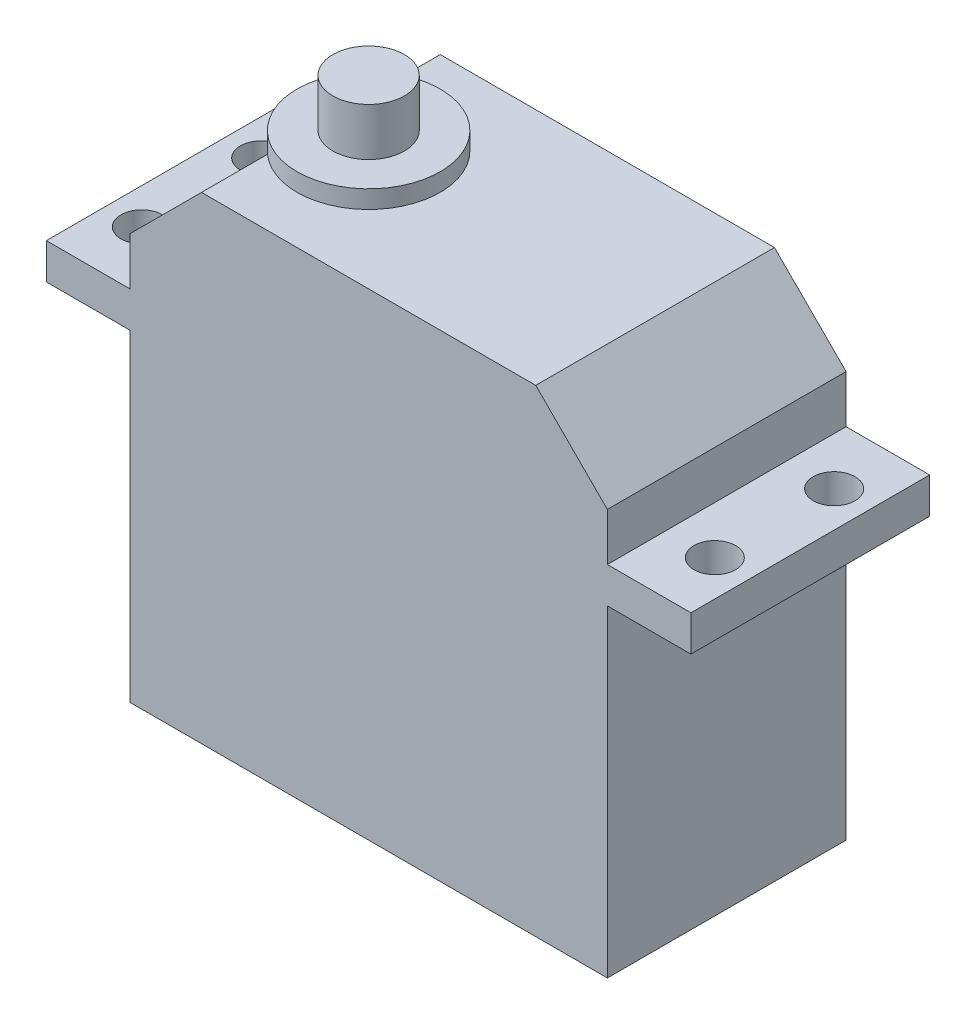
ISO-10303-21;
HEADER;
FILE_DESCRIPTION(('STEP AP214'),'2;1');
FILE_NAME('part.step','',(''),(''),'','','');
FILE_SCHEMA(('AUTOMOTIVE_DESIGN { 1 0 10303 214 1 1 1 1 }'));
ENDSEC;
DATA;
#1=APPLICATION_CONTEXT('core data for automotive mechanical design processes');
#2=APPLICATION_PROTOCOL_DEFINITION('international standard','automotive_design',2000,#1);
#3=PRODUCT_CONTEXT('',#1,'mechanical');
#4=PRODUCT('Part','Part','',(#3));
#5=PRODUCT_RELATED_PRODUCT_CATEGORY('part','',(#4));
#6=PRODUCT_DEFINITION_FORMATION('','',#4);
#7=PRODUCT_DEFINITION_CONTEXT('part definition',#1,'design');
#8=PRODUCT_DEFINITION('design','',#6,#7);
#9=PRODUCT_DEFINITION_SHAPE('','',#8);
#10=(LENGTH_UNIT() NAMED_UNIT(*) SI_UNIT(.MILLI.,.METRE.));
#11=(NAMED_UNIT(*) PLANE_ANGLE_UNIT() SI_UNIT($,.RADIAN.));
#12=(NAMED_UNIT(*) SI_UNIT($,.STERADIAN.) SOLID_ANGLE_UNIT());
#13=UNCERTAINTY_MEASURE_WITH_UNIT(LENGTH_MEASURE(1.E-05),#10,'distance_accuracy_value','');
#14=(GEOMETRIC_REPRESENTATION_CONTEXT(3) GLOBAL_UNCERTAINTY_ASSIGNED_CONTEXT((#13)) GLOBAL_UNIT_ASSIGNED_CONTEXT((#10,
#11,#12)) REPRESENTATION_CONTEXT('',''));
#15=CARTESIAN_POINT('',(0.,0.,0.));
#16=DIRECTION('',(0.,0.,1.));
#17=DIRECTION('',(1.,0.,0.));
#18=AXIS2_PLACEMENT_3D('',#15,#16,#17);
#19=CARTESIAN_POINT('',(0.,0.,10.));
#20=DIRECTION('',(1.,0.,0.));
#21=DIRECTION('',(0.,0.,-1.));
#22=AXIS2_PLACEMENT_3D('',#19,#20,#21);
#23=PLANE('',#22);
#24=DIRECTION('',(0.,0.,1.));
#25=VECTOR('',#24,1.);
#26=CARTESIAN_POINT('',(0.,27.,10.));
#27=LINE('',#26,#25);
#28=CARTESIAN_POINT('',(0.,27.,-10.));
#29=VERTEX_POINT('',#28);
#30=CARTESIAN_POINT('',(0.,27.,10.));
#31=VERTEX_POINT('',#30);
#32=EDGE_CURVE('E245',#29,#31,#27,.T.);
#33=ORIENTED_EDGE('',*,*,#32,.F.);
#34=DIRECTION('',(0.,-1.,0.));
#35=VECTOR('',#34,1.);
#36=CARTESIAN_POINT('',(0.,0.,-10.));
#37=LINE('',#36,#35);
#38=CARTESIAN_POINT('',(0.,0.,-10.));
#39=VERTEX_POINT('',#38);
#40=EDGE_CURVE('E248',#29,#39,#37,.T.);
#41=ORIENTED_EDGE('',*,*,#40,.T.);
#42=DIRECTION('',(0.,0.,-1.));
#43=VECTOR('',#42,1.);
#44=CARTESIAN_POINT('',(0.,0.,10.));
#45=LINE('',#44,#43);
#46=CARTESIAN_POINT('',(0.,0.,10.));
#47=VERTEX_POINT('',#46);
#48=EDGE_CURVE('E161',#47,#39,#45,.T.);
#49=ORIENTED_EDGE('',*,*,#48,.F.);
#50=DIRECTION('',(0.,-1.,0.));
#51=VECTOR('',#50,1.);
#52=CARTESIAN_POINT('',(0.,0.,10.));
#53=LINE('',#52,#51);
#54=EDGE_CURVE('E252',#31,#47,#53,.T.);
#55=ORIENTED_EDGE('',*,*,#54,.F.);
#56=EDGE_LOOP('',(#33,#41,#49,#55));
#57=FACE_BOUND('',#56,.T.);
#58=ADVANCED_FACE('F47',(#57),#23,.F.);
#59=CARTESIAN_POINT('',(0.,34.,10.));
#60=VERTEX_POINT('',#59);
#61=CARTESIAN_POINT('',(0.,30.,10.));
#62=VERTEX_POINT('',#61);
#63=EDGE_CURVE('E249',#60,#62,#53,.T.);
#64=ORIENTED_EDGE('',*,*,#63,.F.);
#65=DIRECTION('',(0.,0.,-1.));
#66=VECTOR('',#65,1.);
#67=CARTESIAN_POINT('',(0.,34.,10.));
#68=LINE('',#67,#66);
#69=CARTESIAN_POINT('',(0.,34.,-10.));
#70=VERTEX_POINT('',#69);
#71=EDGE_CURVE('E172',#60,#70,#68,.T.);
#72=ORIENTED_EDGE('',*,*,#71,.T.);
#73=CARTESIAN_POINT('',(0.,30.,-10.));
#74=VERTEX_POINT('',#73);
#75=EDGE_CURVE('E261',#70,#74,#37,.T.);
#76=ORIENTED_EDGE('',*,*,#75,.T.);
#77=DIRECTION('',(0.,0.,-1.));
#78=VECTOR('',#77,1.);
#79=CARTESIAN_POINT('',(0.,30.,10.));
#80=LINE('',#79,#78);
#81=EDGE_CURVE('E239',#62,#74,#80,.T.);
#82=ORIENTED_EDGE('',*,*,#81,.F.);
#83=EDGE_LOOP('',(#64,#72,#76,#82));
#84=FACE_BOUND('',#83,.T.);
#85=ADVANCED_FACE('F338',(#84),#23,.F.);
#86=CARTESIAN_POINT('',(40.,0.,10.));
#87=DIRECTION('',(-1.,0.,0.));
#88=DIRECTION('',(0.,0.,1.));
#89=AXIS2_PLACEMENT_3D('',#86,#87,#88);
#90=PLANE('',#89);
#91=DIRECTION('',(0.,0.,-1.));
#92=VECTOR('',#91,1.);
#93=CARTESIAN_POINT('',(40.,27.,10.));
#94=LINE('',#93,#92);
#95=CARTESIAN_POINT('',(40.,27.,10.));
#96=VERTEX_POINT('',#95);
#97=CARTESIAN_POINT('',(40.,27.,-10.));
#98=VERTEX_POINT('',#97);
#99=EDGE_CURVE('E242',#96,#98,#94,.T.);
#100=ORIENTED_EDGE('',*,*,#99,.F.);
#101=DIRECTION('',(0.,1.,0.));
#102=VECTOR('',#101,1.);
#103=CARTESIAN_POINT('',(40.,0.,10.));
#104=LINE('',#103,#102);
#105=CARTESIAN_POINT('',(40.,0.,10.));
#106=VERTEX_POINT('',#105);
#107=EDGE_CURVE('E255',#106,#96,#104,.T.);
#108=ORIENTED_EDGE('',*,*,#107,.F.);
#109=DIRECTION('',(0.,0.,-1.));
#110=VECTOR('',#109,1.);
#111=CARTESIAN_POINT('',(40.,0.,10.));
#112=LINE('',#111,#110);
#113=CARTESIAN_POINT('',(40.,0.,-10.));
#114=VERTEX_POINT('',#113);
#115=EDGE_CURVE('E260',#106,#114,#112,.T.);
#116=ORIENTED_EDGE('',*,*,#115,.T.);
#117=DIRECTION('',(0.,1.,0.));
#118=VECTOR('',#117,1.);
#119=CARTESIAN_POINT('',(40.,0.,-10.));
#120=LINE('',#119,#118);
#121=EDGE_CURVE('E266',#114,#98,#120,.T.);
#122=ORIENTED_EDGE('',*,*,#121,.T.);
#123=EDGE_LOOP('',(#100,#108,#116,#122));
#124=FACE_BOUND('',#123,.T.);
#125=ADVANCED_FACE('F314',(#124),#90,.F.);
#126=CARTESIAN_POINT('',(40.,30.,-10.));
#127=VERTEX_POINT('',#126);
#128=CARTESIAN_POINT('',(40.,34.,-10.));
#129=VERTEX_POINT('',#128);
#130=EDGE_CURVE('E265',#127,#129,#120,.T.);
#131=ORIENTED_EDGE('',*,*,#130,.T.);
#132=DIRECTION('',(0.,0.,1.));
#133=VECTOR('',#132,1.);
#134=CARTESIAN_POINT('',(40.,34.,10.));
#135=LINE('',#134,#133);
#136=CARTESIAN_POINT('',(40.,34.,10.));
#137=VERTEX_POINT('',#136);
#138=EDGE_CURVE('E281',#129,#137,#135,.T.);
#139=ORIENTED_EDGE('',*,*,#138,.T.);
#140=CARTESIAN_POINT('',(40.,30.,10.));
#141=VERTEX_POINT('',#140);
#142=EDGE_CURVE('E254',#141,#137,#104,.T.);
#143=ORIENTED_EDGE('',*,*,#142,.F.);
#144=DIRECTION('',(0.,0.,1.));
#145=VECTOR('',#144,1.);
#146=CARTESIAN_POINT('',(40.,30.,10.));
#147=LINE('',#146,#145);
#148=EDGE_CURVE('E236',#127,#141,#147,.T.);
#149=ORIENTED_EDGE('',*,*,#148,.F.);
#150=EDGE_LOOP('',(#131,#139,#143,#149));
#151=FACE_BOUND('',#150,.T.);
#152=ADVANCED_FACE('F297',(#151),#90,.F.);
#153=CARTESIAN_POINT('',(0.,0.,10.));
#154=DIRECTION('',(0.,1.,0.));
#155=DIRECTION('',(0.,0.,1.));
#156=AXIS2_PLACEMENT_3D('',#153,#154,#155);
#157=PLANE('',#156);
#158=DIRECTION('',(1.,0.,0.));
#159=VECTOR('',#158,1.);
#160=CARTESIAN_POINT('',(0.,0.,-10.));
#161=LINE('',#160,#159);
#162=EDGE_CURVE('E263',#39,#114,#161,.T.);
#163=ORIENTED_EDGE('',*,*,#162,.T.);
#164=ORIENTED_EDGE('',*,*,#115,.F.);
#165=DIRECTION('',(1.,0.,0.));
#166=VECTOR('',#165,1.);
#167=CARTESIAN_POINT('',(0.,0.,10.));
#168=LINE('',#167,#166);
#169=EDGE_CURVE('E251',#47,#106,#168,.T.);
#170=ORIENTED_EDGE('',*,*,#169,.F.);
#171=ORIENTED_EDGE('',*,*,#48,.T.);
#172=EDGE_LOOP('',(#163,#164,#170,#171));
#173=FACE_BOUND('',#172,.T.);
#174=ADVANCED_FACE('F319',(#173),#157,.F.);
#175=CARTESIAN_POINT('',(0.,40.,10.));
#176=DIRECTION('',(0.,-1.,0.));
#177=DIRECTION('',(0.,0.,-1.));
#178=AXIS2_PLACEMENT_3D('',#175,#176,#177);
#179=PLANE('',#178);
#180=DIRECTION('',(0.,0.,1.));
#181=VECTOR('',#180,1.);
#182=CARTESIAN_POINT('',(6.00000000000002,40.,10.));
#183=LINE('',#182,#181);
#184=CARTESIAN_POINT('',(6.00000000000002,40.,-10.));
#185=VERTEX_POINT('',#184);
#186=CARTESIAN_POINT('',(6.00000000000002,40.,-4.47213595499959));
#187=VERTEX_POINT('',#186);
#188=EDGE_CURVE('E160',#185,#187,#183,.T.);
#189=ORIENTED_EDGE('',*,*,#188,.T.);
#190=CARTESIAN_POINT('',(10.,40.,0.));
#191=DIRECTION('',(0.,-1.,0.));
#192=DIRECTION('',(0.,0.,-1.));
#193=AXIS2_PLACEMENT_3D('',#190,#191,#192);
#194=CIRCLE('',#193,6.);
#195=CARTESIAN_POINT('',(6.00000000000002,40.,4.47213595499959));
#196=VERTEX_POINT('',#195);
#197=EDGE_CURVE('E164',#187,#196,#194,.T.);
#198=ORIENTED_EDGE('',*,*,#197,.T.);
#199=CARTESIAN_POINT('',(6.00000000000002,40.,10.));
#200=VERTEX_POINT('',#199);
#201=EDGE_CURVE('E155',#196,#200,#183,.T.);
#202=ORIENTED_EDGE('',*,*,#201,.T.);
#203=DIRECTION('',(-1.,0.,0.));
#204=VECTOR('',#203,1.);
#205=CARTESIAN_POINT('',(0.,40.,10.));
#206=LINE('',#205,#204);
#207=CARTESIAN_POINT('',(34.,40.,10.));
#208=VERTEX_POINT('',#207);
#209=EDGE_CURVE('E258',#208,#200,#206,.T.);
#210=ORIENTED_EDGE('',*,*,#209,.F.);
#211=DIRECTION('',(0.,0.,-1.));
#212=VECTOR('',#211,1.);
#213=CARTESIAN_POINT('',(34.,40.,10.));
#214=LINE('',#213,#212);
#215=CARTESIAN_POINT('',(34.,40.,-10.));
#216=VERTEX_POINT('',#215);
#217=EDGE_CURVE('E274',#208,#216,#214,.T.);
#218=ORIENTED_EDGE('',*,*,#217,.T.);
#219=DIRECTION('',(-1.,0.,0.));
#220=VECTOR('',#219,1.);
#221=CARTESIAN_POINT('',(0.,40.,-10.));
#222=LINE('',#221,#220);
#223=EDGE_CURVE('E268',#216,#185,#222,.T.);
#224=ORIENTED_EDGE('',*,*,#223,.T.);
#225=EDGE_LOOP('',(#189,#198,#202,#210,#218,#224));
#226=FACE_BOUND('',#225,.T.);
#227=ADVANCED_FACE('F165',(#226),#179,.F.);
#228=CARTESIAN_POINT('',(0.,0.,10.));
#229=DIRECTION('',(0.,0.,-1.));
#230=DIRECTION('',(-1.,0.,0.));
#231=AXIS2_PLACEMENT_3D('',#228,#229,#230);
#232=PLANE('',#231);
#233=ORIENTED_EDGE('',*,*,#142,.T.);
#234=DIRECTION('',(0.707106781186546,-0.707106781186549,0.));
#235=VECTOR('',#234,1.);
#236=CARTESIAN_POINT('',(34.,40.,10.));
#237=LINE('',#236,#235);
#238=EDGE_CURVE('E175',#137,#208,#237,.F.);
#239=ORIENTED_EDGE('',*,*,#238,.T.);
#240=ORIENTED_EDGE('',*,*,#209,.T.);
#241=DIRECTION('',(0.707106781186549,0.707106781186546,0.));
#242=VECTOR('',#241,1.);
#243=CARTESIAN_POINT('',(0.,34.,10.));
#244=LINE('',#243,#242);
#245=EDGE_CURVE('E72',#200,#60,#244,.F.);
#246=ORIENTED_EDGE('',*,*,#245,.T.);
#247=ORIENTED_EDGE('',*,*,#63,.T.);
#248=DIRECTION('',(-1.,0.,0.));
#249=VECTOR('',#248,1.);
#250=CARTESIAN_POINT('',(-7.,30.,10.));
#251=LINE('',#250,#249);
#252=CARTESIAN_POINT('',(-7.,30.,10.));
#253=VERTEX_POINT('',#252);
#254=EDGE_CURVE('E209',#62,#253,#251,.T.);
#255=ORIENTED_EDGE('',*,*,#254,.T.);
#256=DIRECTION('',(0.,-1.,0.));
#257=VECTOR('',#256,1.);
#258=CARTESIAN_POINT('',(-7.,30.,10.));
#259=LINE('',#258,#257);
#260=CARTESIAN_POINT('',(-7.,27.,10.));
#261=VERTEX_POINT('',#260);
#262=EDGE_CURVE('E199',#253,#261,#259,.T.);
#263=ORIENTED_EDGE('',*,*,#262,.T.);
#264=DIRECTION('',(1.,0.,0.));
#265=VECTOR('',#264,1.);
#266=CARTESIAN_POINT('',(-7.,27.,10.));
#267=LINE('',#266,#265);
#268=EDGE_CURVE('E204',#261,#31,#267,.T.);
#269=ORIENTED_EDGE('',*,*,#268,.T.);
#270=ORIENTED_EDGE('',*,*,#54,.T.);
#271=ORIENTED_EDGE('',*,*,#169,.T.);
#272=ORIENTED_EDGE('',*,*,#107,.T.);
#273=CARTESIAN_POINT('',(47.,27.,10.));
#274=VERTEX_POINT('',#273);
#275=EDGE_CURVE('E202',#96,#274,#267,.T.);
#276=ORIENTED_EDGE('',*,*,#275,.T.);
#277=DIRECTION('',(0.,1.,0.));
#278=VECTOR('',#277,1.);
#279=CARTESIAN_POINT('',(47.,30.,10.));
#280=LINE('',#279,#278);
#281=CARTESIAN_POINT('',(47.,30.,10.));
#282=VERTEX_POINT('',#281);
#283=EDGE_CURVE('E207',#274,#282,#280,.T.);
#284=ORIENTED_EDGE('',*,*,#283,.T.);
#285=EDGE_CURVE('E210',#282,#141,#251,.T.);
#286=ORIENTED_EDGE('',*,*,#285,.T.);
#287=EDGE_LOOP('',(#233,#239,#240,#246,#247,#255,#263,#269,#270,#271,#272,#276,#284,#286));
#288=FACE_BOUND('',#287,.T.);
#289=ADVANCED_FACE('F285',(#288),#232,.F.);
#290=CARTESIAN_POINT('',(0.,0.,-10.));
#291=DIRECTION('',(0.,0.,-1.));
#292=DIRECTION('',(-1.,0.,0.));
#293=AXIS2_PLACEMENT_3D('',#290,#291,#292);
#294=PLANE('',#293);
#295=ORIENTED_EDGE('',*,*,#223,.F.);
#296=DIRECTION('',(-0.707106781186546,0.707106781186549,0.));
#297=VECTOR('',#296,1.);
#298=CARTESIAN_POINT('',(37.0000000000001,36.9999999999999,-10.));
#299=LINE('',#298,#297);
#300=EDGE_CURVE('E279',#216,#129,#299,.F.);
#301=ORIENTED_EDGE('',*,*,#300,.T.);
#302=ORIENTED_EDGE('',*,*,#130,.F.);
#303=DIRECTION('',(-1.,0.,0.));
#304=VECTOR('',#303,1.);
#305=CARTESIAN_POINT('',(-7.,30.,-10.));
#306=LINE('',#305,#304);
#307=CARTESIAN_POINT('',(47.,30.,-10.));
#308=VERTEX_POINT('',#307);
#309=EDGE_CURVE('E203',#308,#127,#306,.T.);
#310=ORIENTED_EDGE('',*,*,#309,.F.);
#311=DIRECTION('',(0.,1.,0.));
#312=VECTOR('',#311,1.);
#313=CARTESIAN_POINT('',(47.,30.,-10.));
#314=LINE('',#313,#312);
#315=CARTESIAN_POINT('',(47.,27.,-10.));
#316=VERTEX_POINT('',#315);
#317=EDGE_CURVE('E220',#316,#308,#314,.T.);
#318=ORIENTED_EDGE('',*,*,#317,.F.);
#319=DIRECTION('',(1.,0.,0.));
#320=VECTOR('',#319,1.);
#321=CARTESIAN_POINT('',(-7.,27.,-10.));
#322=LINE('',#321,#320);
#323=EDGE_CURVE('E216',#98,#316,#322,.T.);
#324=ORIENTED_EDGE('',*,*,#323,.F.);
#325=ORIENTED_EDGE('',*,*,#121,.F.);
#326=ORIENTED_EDGE('',*,*,#162,.F.);
#327=ORIENTED_EDGE('',*,*,#40,.F.);
#328=CARTESIAN_POINT('',(-7.,27.,-10.));
#329=VERTEX_POINT('',#328);
#330=EDGE_CURVE('E217',#329,#29,#322,.T.);
#331=ORIENTED_EDGE('',*,*,#330,.F.);
#332=DIRECTION('',(0.,-1.,0.));
#333=VECTOR('',#332,1.);
#334=CARTESIAN_POINT('',(-7.,30.,-10.));
#335=LINE('',#334,#333);
#336=CARTESIAN_POINT('',(-7.,30.,-10.));
#337=VERTEX_POINT('',#336);
#338=EDGE_CURVE('E168',#337,#329,#335,.T.);
#339=ORIENTED_EDGE('',*,*,#338,.F.);
#340=EDGE_CURVE('E222',#74,#337,#306,.T.);
#341=ORIENTED_EDGE('',*,*,#340,.F.);
#342=ORIENTED_EDGE('',*,*,#75,.F.);
#343=DIRECTION('',(-0.707106781186549,-0.707106781186546,0.));
#344=VECTOR('',#343,1.);
#345=CARTESIAN_POINT('',(-17.,17.0000000000001,-10.));
#346=LINE('',#345,#344);
#347=EDGE_CURVE('E277',#70,#185,#346,.F.);
#348=ORIENTED_EDGE('',*,*,#347,.T.);
#349=EDGE_LOOP('',(#295,#301,#302,#310,#318,#324,#325,#326,#327,#331,#339,#341,#342,#348));
#350=FACE_BOUND('',#349,.T.);
#351=ADVANCED_FACE('F293',(#350),#294,.T.);
#352=CARTESIAN_POINT('',(47.,30.,10.));
#353=DIRECTION('',(-1.,0.,0.));
#354=DIRECTION('',(0.,0.,1.));
#355=AXIS2_PLACEMENT_3D('',#352,#353,#354);
#356=PLANE('',#355);
#357=ORIENTED_EDGE('',*,*,#317,.T.);
#358=DIRECTION('',(0.,0.,-1.));
#359=VECTOR('',#358,1.);
#360=CARTESIAN_POINT('',(47.,30.,10.));
#361=LINE('',#360,#359);
#362=EDGE_CURVE('E227',#282,#308,#361,.T.);
#363=ORIENTED_EDGE('',*,*,#362,.F.);
#364=ORIENTED_EDGE('',*,*,#283,.F.);
#365=DIRECTION('',(0.,0.,-1.));
#366=VECTOR('',#365,1.);
#367=CARTESIAN_POINT('',(47.,27.,10.));
#368=LINE('',#367,#366);
#369=EDGE_CURVE('E230',#274,#316,#368,.T.);
#370=ORIENTED_EDGE('',*,*,#369,.T.);
#371=EDGE_LOOP('',(#357,#363,#364,#370));
#372=FACE_BOUND('',#371,.T.);
#373=ADVANCED_FACE('F306',(#372),#356,.F.);
#374=CARTESIAN_POINT('',(-7.,30.,10.));
#375=DIRECTION('',(0.,-1.,0.));
#376=DIRECTION('',(0.,0.,-1.));
#377=AXIS2_PLACEMENT_3D('',#374,#375,#376);
#378=PLANE('',#377);
#379=CARTESIAN_POINT('',(44.,30.,-5.));
#380=DIRECTION('',(0.,1.,0.));
#381=DIRECTION('',(0.,0.,1.));
#382=AXIS2_PLACEMENT_3D('',#379,#380,#381);
#383=CIRCLE('',#382,1.75);
#384=CARTESIAN_POINT('',(44.,30.,-3.25));
#385=VERTEX_POINT('',#384);
#386=EDGE_CURVE('E576',#385,#385,#383,.T.);
#387=ORIENTED_EDGE('',*,*,#386,.F.);
#388=EDGE_LOOP('',(#387));
#389=FACE_BOUND('',#388,.T.);
#390=CARTESIAN_POINT('',(44.,30.,5.));
#391=DIRECTION('',(0.,1.,0.));
#392=DIRECTION('',(0.,0.,1.));
#393=AXIS2_PLACEMENT_3D('',#390,#391,#392);
#394=CIRCLE('',#393,1.75);
#395=CARTESIAN_POINT('',(44.,30.,6.75));
#396=VERTEX_POINT('',#395);
#397=EDGE_CURVE('E579',#396,#396,#394,.T.);
#398=ORIENTED_EDGE('',*,*,#397,.F.);
#399=EDGE_LOOP('',(#398));
#400=FACE_BOUND('',#399,.T.);
#401=ORIENTED_EDGE('',*,*,#309,.T.);
#402=ORIENTED_EDGE('',*,*,#148,.T.);
#403=ORIENTED_EDGE('',*,*,#285,.F.);
#404=ORIENTED_EDGE('',*,*,#362,.T.);
#405=EDGE_LOOP('',(#401,#402,#403,#404));
#406=FACE_BOUND('',#405,.T.);
#407=ADVANCED_FACE('F300',(#389,#400,#406),#378,.F.);
#408=CARTESIAN_POINT('',(-7.,27.,10.));
#409=DIRECTION('',(0.,1.,0.));
#410=DIRECTION('',(0.,0.,1.));
#411=AXIS2_PLACEMENT_3D('',#408,#409,#410);
#412=PLANE('',#411);
#413=CARTESIAN_POINT('',(44.,27.,-5.));
#414=DIRECTION('',(0.,1.,0.));
#415=DIRECTION('',(0.,0.,1.));
#416=AXIS2_PLACEMENT_3D('',#413,#414,#415);
#417=CIRCLE('',#416,1.75);
#418=CARTESIAN_POINT('',(44.,27.,-3.25));
#419=VERTEX_POINT('',#418);
#420=EDGE_CURVE('E52',#419,#419,#417,.T.);
#421=ORIENTED_EDGE('',*,*,#420,.T.);
#422=EDGE_LOOP('',(#421));
#423=FACE_BOUND('',#422,.T.);
#424=CARTESIAN_POINT('',(44.,27.,5.));
#425=DIRECTION('',(0.,1.,0.));
#426=DIRECTION('',(0.,0.,1.));
#427=AXIS2_PLACEMENT_3D('',#424,#425,#426);
#428=CIRCLE('',#427,1.75);
#429=CARTESIAN_POINT('',(44.,27.,6.75));
#430=VERTEX_POINT('',#429);
#431=EDGE_CURVE('E178',#430,#430,#428,.T.);
#432=ORIENTED_EDGE('',*,*,#431,.T.);
#433=EDGE_LOOP('',(#432));
#434=FACE_BOUND('',#433,.T.);
#435=ORIENTED_EDGE('',*,*,#275,.F.);
#436=ORIENTED_EDGE('',*,*,#99,.T.);
#437=ORIENTED_EDGE('',*,*,#323,.T.);
#438=ORIENTED_EDGE('',*,*,#369,.F.);
#439=EDGE_LOOP('',(#435,#436,#437,#438));
#440=FACE_BOUND('',#439,.T.);
#441=ADVANCED_FACE('F311',(#423,#434,#440),#412,.F.);
#442=CARTESIAN_POINT('',(-3.99999999999999,27.,5.));
#443=DIRECTION('',(0.,1.,0.));
#444=DIRECTION('',(0.,0.,1.));
#445=AXIS2_PLACEMENT_3D('',#442,#443,#444);
#446=CIRCLE('',#445,1.75);
#447=CARTESIAN_POINT('',(-3.99999999999999,27.,6.75));
#448=VERTEX_POINT('',#447);
#449=EDGE_CURVE('E180',#448,#448,#446,.T.);
#450=ORIENTED_EDGE('',*,*,#449,.T.);
#451=EDGE_LOOP('',(#450));
#452=FACE_BOUND('',#451,.T.);
#453=CARTESIAN_POINT('',(-3.99999999999999,27.,-5.));
#454=DIRECTION('',(0.,1.,0.));
#455=DIRECTION('',(0.,0.,1.));
#456=AXIS2_PLACEMENT_3D('',#453,#454,#455);
#457=CIRCLE('',#456,1.75);
#458=CARTESIAN_POINT('',(-3.99999999999999,27.,-3.25));
#459=VERTEX_POINT('',#458);
#460=EDGE_CURVE('E186',#459,#459,#457,.T.);
#461=ORIENTED_EDGE('',*,*,#460,.T.);
#462=EDGE_LOOP('',(#461));
#463=FACE_BOUND('',#462,.T.);
#464=ORIENTED_EDGE('',*,*,#330,.T.);
#465=ORIENTED_EDGE('',*,*,#32,.T.);
#466=ORIENTED_EDGE('',*,*,#268,.F.);
#467=DIRECTION('',(0.,0.,-1.));
#468=VECTOR('',#467,1.);
#469=CARTESIAN_POINT('',(-7.,27.,10.));
#470=LINE('',#469,#468);
#471=EDGE_CURVE('E233',#261,#329,#470,.T.);
#472=ORIENTED_EDGE('',*,*,#471,.T.);
#473=EDGE_LOOP('',(#464,#465,#466,#472));
#474=FACE_BOUND('',#473,.T.);
#475=ADVANCED_FACE('F324',(#452,#463,#474),#412,.F.);
#476=CARTESIAN_POINT('',(-3.99999999999999,30.,5.));
#477=DIRECTION('',(0.,1.,0.));
#478=DIRECTION('',(0.,0.,1.));
#479=AXIS2_PLACEMENT_3D('',#476,#477,#478);
#480=CIRCLE('',#479,1.75);
#481=CARTESIAN_POINT('',(-3.99999999999999,30.,6.75));
#482=VERTEX_POINT('',#481);
#483=EDGE_CURVE('E578',#482,#482,#480,.T.);
#484=ORIENTED_EDGE('',*,*,#483,.F.);
#485=EDGE_LOOP('',(#484));
#486=FACE_BOUND('',#485,.T.);
#487=CARTESIAN_POINT('',(-3.99999999999999,30.,-5.));
#488=DIRECTION('',(0.,1.,0.));
#489=DIRECTION('',(0.,0.,1.));
#490=AXIS2_PLACEMENT_3D('',#487,#488,#489);
#491=CIRCLE('',#490,1.75);
#492=CARTESIAN_POINT('',(-3.99999999999999,30.,-3.25));
#493=VERTEX_POINT('',#492);
#494=EDGE_CURVE('E191',#493,#493,#491,.T.);
#495=ORIENTED_EDGE('',*,*,#494,.F.);
#496=EDGE_LOOP('',(#495));
#497=FACE_BOUND('',#496,.T.);
#498=ORIENTED_EDGE('',*,*,#254,.F.);
#499=ORIENTED_EDGE('',*,*,#81,.T.);
#500=ORIENTED_EDGE('',*,*,#340,.T.);
#501=DIRECTION('',(0.,0.,-1.));
#502=VECTOR('',#501,1.);
#503=CARTESIAN_POINT('',(-7.,30.,10.));
#504=LINE('',#503,#502);
#505=EDGE_CURVE('E213',#253,#337,#504,.T.);
#506=ORIENTED_EDGE('',*,*,#505,.F.);
#507=EDGE_LOOP('',(#498,#499,#500,#506));
#508=FACE_BOUND('',#507,.T.);
#509=ADVANCED_FACE('F335',(#486,#497,#508),#378,.F.);
#510=CARTESIAN_POINT('',(-7.,30.,10.));
#511=DIRECTION('',(1.,0.,0.));
#512=DIRECTION('',(0.,0.,-1.));
#513=AXIS2_PLACEMENT_3D('',#510,#511,#512);
#514=PLANE('',#513);
#515=ORIENTED_EDGE('',*,*,#338,.T.);
#516=ORIENTED_EDGE('',*,*,#471,.F.);
#517=ORIENTED_EDGE('',*,*,#262,.F.);
#518=ORIENTED_EDGE('',*,*,#505,.T.);
#519=EDGE_LOOP('',(#515,#516,#517,#518));
#520=FACE_BOUND('',#519,.T.);
#521=ADVANCED_FACE('F330',(#520),#514,.F.);
#522=CARTESIAN_POINT('',(34.,40.,10.));
#523=DIRECTION('',(-0.707106781186549,-0.707106781186546,0.));
#524=DIRECTION('',(0.,0.,-1.));
#525=AXIS2_PLACEMENT_3D('',#522,#523,#524);
#526=PLANE('',#525);
#527=ORIENTED_EDGE('',*,*,#238,.F.);
#528=ORIENTED_EDGE('',*,*,#138,.F.);
#529=ORIENTED_EDGE('',*,*,#300,.F.);
#530=ORIENTED_EDGE('',*,*,#217,.F.);
#531=EDGE_LOOP('',(#527,#528,#529,#530));
#532=FACE_BOUND('',#531,.T.);
#533=ADVANCED_FACE('F290',(#532),#526,.F.);
#534=CARTESIAN_POINT('',(0.,34.,10.));
#535=DIRECTION('',(0.707106781186546,-0.707106781186549,0.));
#536=DIRECTION('',(0.,0.,-1.));
#537=AXIS2_PLACEMENT_3D('',#534,#535,#536);
#538=PLANE('',#537);
#539=CARTESIAN_POINT('',(10.,44.,0.));
#540=DIRECTION('',(0.707106781186546,-0.707106781186549,0.));
#541=DIRECTION('',(0.707106781186549,0.707106781186546,0.));
#542=AXIS2_PLACEMENT_3D('',#539,#540,#541);
#543=ELLIPSE('',#542,8.48528137423856,6.);
#544=EDGE_CURVE('E57',#187,#196,#543,.F.);
#545=ORIENTED_EDGE('',*,*,#544,.F.);
#546=ORIENTED_EDGE('',*,*,#188,.F.);
#547=ORIENTED_EDGE('',*,*,#347,.F.);
#548=ORIENTED_EDGE('',*,*,#71,.F.);
#549=ORIENTED_EDGE('',*,*,#245,.F.);
#550=ORIENTED_EDGE('',*,*,#201,.F.);
#551=EDGE_LOOP('',(#545,#546,#547,#548,#549,#550));
#552=FACE_BOUND('',#551,.T.);
#553=ADVANCED_FACE('F50',(#552),#538,.F.);
#554=CARTESIAN_POINT('',(10.,20.,0.));
#555=DIRECTION('',(0.,1.,0.));
#556=DIRECTION('',(0.,0.,1.));
#557=AXIS2_PLACEMENT_3D('',#554,#555,#556);
#558=CYLINDRICAL_SURFACE('',#557,6.);
#559=CARTESIAN_POINT('',(10.,41.5,0.));
#560=DIRECTION('',(0.,1.,0.));
#561=DIRECTION('',(0.,0.,1.));
#562=AXIS2_PLACEMENT_3D('',#559,#560,#561);
#563=CIRCLE('',#562,6.);
#564=CARTESIAN_POINT('',(10.,41.5,6.));
#565=VERTEX_POINT('',#564);
#566=EDGE_CURVE('E169',#565,#565,#563,.T.);
#567=ORIENTED_EDGE('',*,*,#566,.F.);
#568=EDGE_LOOP('',(#567));
#569=FACE_BOUND('',#568,.T.);
#570=ORIENTED_EDGE('',*,*,#197,.F.);
#571=ORIENTED_EDGE('',*,*,#544,.T.);
#572=EDGE_LOOP('',(#570,#571));
#573=FACE_BOUND('',#572,.T.);
#574=ADVANCED_FACE('F171',(#569,#573),#558,.T.);
#575=CARTESIAN_POINT('',(10.,41.5,0.));
#576=DIRECTION('',(0.,1.,0.));
#577=DIRECTION('',(0.,0.,1.));
#578=AXIS2_PLACEMENT_3D('',#575,#576,#577);
#579=PLANE('',#578);
#580=CARTESIAN_POINT('',(10.,41.5,0.));
#581=DIRECTION('',(0.,1.,0.));
#582=DIRECTION('',(0.,0.,1.));
#583=AXIS2_PLACEMENT_3D('',#580,#581,#582);
#584=CIRCLE('',#583,3.);
#585=CARTESIAN_POINT('',(10.,41.5,3.));
#586=VERTEX_POINT('',#585);
#587=EDGE_CURVE('E11',#586,#586,#584,.T.);
#588=ORIENTED_EDGE('',*,*,#587,.F.);
#589=EDGE_LOOP('',(#588));
#590=FACE_BOUND('',#589,.T.);
#591=ORIENTED_EDGE('',*,*,#566,.T.);
#592=EDGE_LOOP('',(#591));
#593=FACE_BOUND('',#592,.T.);
#594=ADVANCED_FACE('F480',(#590,#593),#579,.T.);
#595=CARTESIAN_POINT('',(10.,45.5,0.));
#596=DIRECTION('',(0.,-1.,0.));
#597=DIRECTION('',(0.,0.,-1.));
#598=AXIS2_PLACEMENT_3D('',#595,#596,#597);
#599=CYLINDRICAL_SURFACE('',#598,3.);
#600=CARTESIAN_POINT('',(10.,45.5,0.));
#601=DIRECTION('',(0.,1.,0.));
#602=DIRECTION('',(0.,0.,1.));
#603=AXIS2_PLACEMENT_3D('',#600,#601,#602);
#604=CIRCLE('',#603,3.);
#605=CARTESIAN_POINT('',(10.,45.5,3.));
#606=VERTEX_POINT('',#605);
#607=EDGE_CURVE('E184',#606,#606,#604,.T.);
#608=ORIENTED_EDGE('',*,*,#607,.F.);
#609=EDGE_LOOP('',(#608));
#610=FACE_BOUND('',#609,.T.);
#611=ORIENTED_EDGE('',*,*,#587,.T.);
#612=EDGE_LOOP('',(#611));
#613=FACE_BOUND('',#612,.T.);
#614=ADVANCED_FACE('F491',(#610,#613),#599,.T.);
#615=CARTESIAN_POINT('',(10.,45.5,0.));
#616=DIRECTION('',(0.,1.,0.));
#617=DIRECTION('',(0.,0.,1.));
#618=AXIS2_PLACEMENT_3D('',#615,#616,#617);
#619=PLANE('',#618);
#620=ORIENTED_EDGE('',*,*,#607,.T.);
#621=EDGE_LOOP('',(#620));
#622=FACE_BOUND('',#621,.T.);
#623=ADVANCED_FACE('F502',(#622),#619,.T.);
#624=CARTESIAN_POINT('',(-3.99999999999999,0.,-5.));
#625=DIRECTION('',(0.,1.,0.));
#626=DIRECTION('',(0.,0.,1.));
#627=AXIS2_PLACEMENT_3D('',#624,#625,#626);
#628=CYLINDRICAL_SURFACE('',#627,1.75);
#629=ORIENTED_EDGE('',*,*,#494,.T.);
#630=EDGE_LOOP('',(#629));
#631=FACE_BOUND('',#630,.T.);
#632=ORIENTED_EDGE('',*,*,#460,.F.);
#633=EDGE_LOOP('',(#632));
#634=FACE_BOUND('',#633,.T.);
#635=ADVANCED_FACE('F510',(#631,#634),#628,.F.);
#636=CARTESIAN_POINT('',(-3.99999999999999,0.,5.));
#637=DIRECTION('',(0.,1.,0.));
#638=DIRECTION('',(0.,0.,1.));
#639=AXIS2_PLACEMENT_3D('',#636,#637,#638);
#640=CYLINDRICAL_SURFACE('',#639,1.75);
#641=ORIENTED_EDGE('',*,*,#483,.T.);
#642=EDGE_LOOP('',(#641));
#643=FACE_BOUND('',#642,.T.);
#644=ORIENTED_EDGE('',*,*,#449,.F.);
#645=EDGE_LOOP('',(#644));
#646=FACE_BOUND('',#645,.T.);
#647=ADVANCED_FACE('F519',(#643,#646),#640,.F.);
#648=CARTESIAN_POINT('',(44.,0.,5.));
#649=DIRECTION('',(0.,1.,0.));
#650=DIRECTION('',(0.,0.,1.));
#651=AXIS2_PLACEMENT_3D('',#648,#649,#650);
#652=CYLINDRICAL_SURFACE('',#651,1.75);
#653=ORIENTED_EDGE('',*,*,#397,.T.);
#654=EDGE_LOOP('',(#653));
#655=FACE_BOUND('',#654,.T.);
#656=ORIENTED_EDGE('',*,*,#431,.F.);
#657=EDGE_LOOP('',(#656));
#658=FACE_BOUND('',#657,.T.);
#659=ADVANCED_FACE('F529',(#655,#658),#652,.F.);
#660=CARTESIAN_POINT('',(44.,0.,-5.));
#661=DIRECTION('',(0.,1.,0.));
#662=DIRECTION('',(0.,0.,1.));
#663=AXIS2_PLACEMENT_3D('',#660,#661,#662);
#664=CYLINDRICAL_SURFACE('',#663,1.75);
#665=ORIENTED_EDGE('',*,*,#386,.T.);
#666=EDGE_LOOP('',(#665));
#667=FACE_BOUND('',#666,.T.);
#668=ORIENTED_EDGE('',*,*,#420,.F.);
#669=EDGE_LOOP('',(#668));
#670=FACE_BOUND('',#669,.T.);
#671=ADVANCED_FACE('F539',(#667,#670),#664,.F.);
#672=CLOSED_SHELL('',(#58,#85,#125,#152,#174,#227,#289,#351,#373,#407,#441,#475,#509,#521,#533,
#553,#574,#594,#614,#623,#635,#647,#659,#671));
#673=MANIFOLD_SOLID_BREP('B2',#672);
#674=ADVANCED_BREP_SHAPE_REPRESENTATION('',(#18,#673),#14);
#675=SHAPE_DEFINITION_REPRESENTATION(#9,#674);
ENDSEC;
END-ISO-10303-21;
